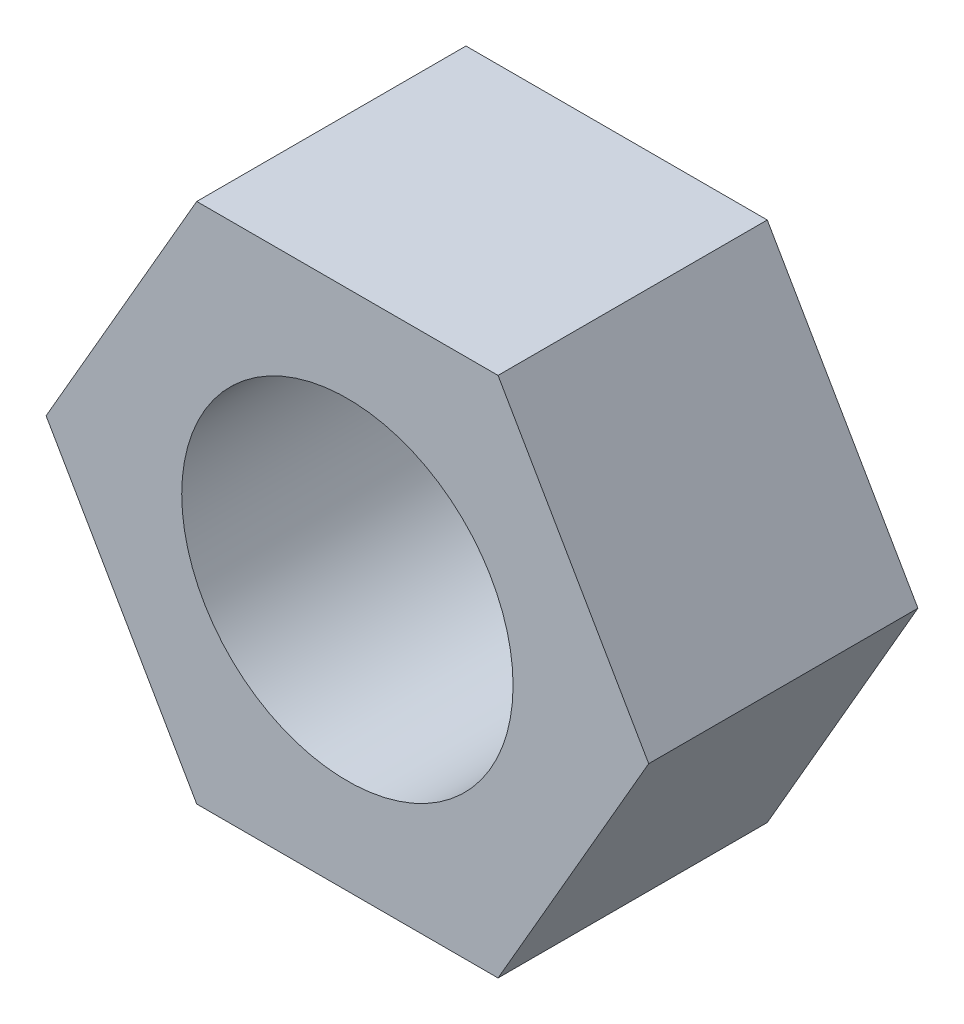
ISO-10303-21;
HEADER;
FILE_DESCRIPTION(('STEP AP214'),'2;1');
FILE_NAME('part.step','',(''),(''),'','','');
FILE_SCHEMA(('AUTOMOTIVE_DESIGN { 1 0 10303 214 1 1 1 1 }'));
ENDSEC;
DATA;
#1=APPLICATION_CONTEXT('core data for automotive mechanical design processes');
#2=APPLICATION_PROTOCOL_DEFINITION('international standard','automotive_design',2000,#1);
#3=PRODUCT_CONTEXT('',#1,'mechanical');
#4=PRODUCT('Part','Part','',(#3));
#5=PRODUCT_RELATED_PRODUCT_CATEGORY('part','',(#4));
#6=PRODUCT_DEFINITION_FORMATION('','',#4);
#7=PRODUCT_DEFINITION_CONTEXT('part definition',#1,'design');
#8=PRODUCT_DEFINITION('design','',#6,#7);
#9=PRODUCT_DEFINITION_SHAPE('','',#8);
#10=(LENGTH_UNIT() NAMED_UNIT(*) SI_UNIT(.MILLI.,.METRE.));
#11=(NAMED_UNIT(*) PLANE_ANGLE_UNIT() SI_UNIT($,.RADIAN.));
#12=(NAMED_UNIT(*) SI_UNIT($,.STERADIAN.) SOLID_ANGLE_UNIT());
#13=UNCERTAINTY_MEASURE_WITH_UNIT(LENGTH_MEASURE(1.E-05),#10,'distance_accuracy_value','');
#14=(GEOMETRIC_REPRESENTATION_CONTEXT(3) GLOBAL_UNCERTAINTY_ASSIGNED_CONTEXT((#13)) GLOBAL_UNIT_ASSIGNED_CONTEXT((#10,
#11,#12)) REPRESENTATION_CONTEXT('',''));
#15=CARTESIAN_POINT('',(0.,0.,0.));
#16=DIRECTION('',(0.,0.,1.));
#17=DIRECTION('',(1.,0.,0.));
#18=AXIS2_PLACEMENT_3D('',#15,#16,#17);
#19=CARTESIAN_POINT('',(0.,0.,6.5));
#20=DIRECTION('',(0.,0.,1.));
#21=DIRECTION('',(1.,0.,0.));
#22=AXIS2_PLACEMENT_3D('',#19,#20,#21);
#23=PLANE('',#22);
#24=DIRECTION('',(0.5,0.866025403784439,0.));
#25=VECTOR('',#24,1.);
#26=CARTESIAN_POINT('',(3.63730669589464,253.7,6.5));
#27=LINE('',#26,#25);
#28=CARTESIAN_POINT('',(3.63730669589464,253.7,6.5));
#29=VERTEX_POINT('',#28);
#30=CARTESIAN_POINT('',(7.2746133917893,260.,6.5));
#31=VERTEX_POINT('',#30);
#32=EDGE_CURVE('E128',#29,#31,#27,.T.);
#33=ORIENTED_EDGE('',*,*,#32,.T.);
#34=DIRECTION('',(-0.5,0.866025403784439,0.));
#35=VECTOR('',#34,1.);
#36=CARTESIAN_POINT('',(7.2746133917893,260.,6.5));
#37=LINE('',#36,#35);
#38=CARTESIAN_POINT('',(3.63730669589464,266.3,6.5));
#39=VERTEX_POINT('',#38);
#40=EDGE_CURVE('E86',#31,#39,#37,.T.);
#41=ORIENTED_EDGE('',*,*,#40,.T.);
#42=DIRECTION('',(-1.,0.,0.));
#43=VECTOR('',#42,1.);
#44=CARTESIAN_POINT('',(3.63730669589464,266.3,6.5));
#45=LINE('',#44,#43);
#46=CARTESIAN_POINT('',(-3.6373066958946,266.3,6.5));
#47=VERTEX_POINT('',#46);
#48=EDGE_CURVE('E99',#39,#47,#45,.T.);
#49=ORIENTED_EDGE('',*,*,#48,.T.);
#50=DIRECTION('',(-0.500000000000001,-0.866025403784438,0.));
#51=VECTOR('',#50,1.);
#52=CARTESIAN_POINT('',(-3.6373066958946,266.3,6.5));
#53=LINE('',#52,#51);
#54=CARTESIAN_POINT('',(-7.2746133917893,260.,6.5));
#55=VERTEX_POINT('',#54);
#56=EDGE_CURVE('E93',#47,#55,#53,.T.);
#57=ORIENTED_EDGE('',*,*,#56,.T.);
#58=DIRECTION('',(0.499999999999999,-0.866025403784439,0.));
#59=VECTOR('',#58,1.);
#60=CARTESIAN_POINT('',(-7.2746133917893,260.,6.5));
#61=LINE('',#60,#59);
#62=CARTESIAN_POINT('',(-3.63730669589468,253.7,6.5));
#63=VERTEX_POINT('',#62);
#64=EDGE_CURVE('E97',#55,#63,#61,.T.);
#65=ORIENTED_EDGE('',*,*,#64,.T.);
#66=DIRECTION('',(1.,0.,0.));
#67=VECTOR('',#66,1.);
#68=CARTESIAN_POINT('',(-3.63730669589468,253.7,6.5));
#69=LINE('',#68,#67);
#70=EDGE_CURVE('E49',#63,#29,#69,.T.);
#71=ORIENTED_EDGE('',*,*,#70,.T.);
#72=EDGE_LOOP('',(#33,#41,#49,#57,#65,#71));
#73=FACE_BOUND('',#72,.T.);
#74=CARTESIAN_POINT('',(0.,260.,6.5));
#75=DIRECTION('',(0.,0.,1.));
#76=DIRECTION('',(1.,0.,0.));
#77=AXIS2_PLACEMENT_3D('',#74,#75,#76);
#78=CIRCLE('',#77,4.);
#79=CARTESIAN_POINT('',(-4.,260.,6.5));
#80=VERTEX_POINT('',#79);
#81=EDGE_CURVE('E121',#80,#80,#78,.T.);
#82=ORIENTED_EDGE('',*,*,#81,.F.);
#83=EDGE_LOOP('',(#82));
#84=FACE_BOUND('',#83,.T.);
#85=ADVANCED_FACE('F32',(#73,#84),#23,.T.);
#86=CARTESIAN_POINT('',(0.,0.,0.));
#87=DIRECTION('',(0.,0.,1.));
#88=DIRECTION('',(1.,0.,0.));
#89=AXIS2_PLACEMENT_3D('',#86,#87,#88);
#90=PLANE('',#89);
#91=DIRECTION('',(0.5,0.866025403784439,0.));
#92=VECTOR('',#91,1.);
#93=CARTESIAN_POINT('',(3.63730669589464,253.7,0.));
#94=LINE('',#93,#92);
#95=CARTESIAN_POINT('',(3.63730669589464,253.7,0.));
#96=VERTEX_POINT('',#95);
#97=CARTESIAN_POINT('',(7.2746133917893,260.,0.));
#98=VERTEX_POINT('',#97);
#99=EDGE_CURVE('E117',#96,#98,#94,.T.);
#100=ORIENTED_EDGE('',*,*,#99,.F.);
#101=DIRECTION('',(1.,0.,0.));
#102=VECTOR('',#101,1.);
#103=CARTESIAN_POINT('',(-3.63730669589468,253.7,0.));
#104=LINE('',#103,#102);
#105=CARTESIAN_POINT('',(-3.63730669589468,253.7,0.));
#106=VERTEX_POINT('',#105);
#107=EDGE_CURVE('E78',#106,#96,#104,.T.);
#108=ORIENTED_EDGE('',*,*,#107,.F.);
#109=DIRECTION('',(0.499999999999999,-0.866025403784439,0.));
#110=VECTOR('',#109,1.);
#111=CARTESIAN_POINT('',(-7.2746133917893,260.,0.));
#112=LINE('',#111,#110);
#113=CARTESIAN_POINT('',(-7.2746133917893,260.,0.));
#114=VERTEX_POINT('',#113);
#115=EDGE_CURVE('E72',#114,#106,#112,.T.);
#116=ORIENTED_EDGE('',*,*,#115,.F.);
#117=DIRECTION('',(-0.500000000000001,-0.866025403784438,0.));
#118=VECTOR('',#117,1.);
#119=CARTESIAN_POINT('',(-3.6373066958946,266.3,0.));
#120=LINE('',#119,#118);
#121=CARTESIAN_POINT('',(-3.6373066958946,266.3,0.));
#122=VERTEX_POINT('',#121);
#123=EDGE_CURVE('E107',#122,#114,#120,.T.);
#124=ORIENTED_EDGE('',*,*,#123,.F.);
#125=DIRECTION('',(-1.,0.,0.));
#126=VECTOR('',#125,1.);
#127=CARTESIAN_POINT('',(3.63730669589464,266.3,0.));
#128=LINE('',#127,#126);
#129=CARTESIAN_POINT('',(3.63730669589464,266.3,0.));
#130=VERTEX_POINT('',#129);
#131=EDGE_CURVE('E123',#130,#122,#128,.T.);
#132=ORIENTED_EDGE('',*,*,#131,.F.);
#133=DIRECTION('',(-0.5,0.866025403784439,0.));
#134=VECTOR('',#133,1.);
#135=CARTESIAN_POINT('',(7.2746133917893,260.,0.));
#136=LINE('',#135,#134);
#137=EDGE_CURVE('E120',#98,#130,#136,.T.);
#138=ORIENTED_EDGE('',*,*,#137,.F.);
#139=EDGE_LOOP('',(#100,#108,#116,#124,#132,#138));
#140=FACE_BOUND('',#139,.T.);
#141=CARTESIAN_POINT('',(0.,260.,0.));
#142=DIRECTION('',(0.,0.,1.));
#143=DIRECTION('',(1.,0.,0.));
#144=AXIS2_PLACEMENT_3D('',#141,#142,#143);
#145=CIRCLE('',#144,4.);
#146=CARTESIAN_POINT('',(-4.,260.,0.));
#147=VERTEX_POINT('',#146);
#148=EDGE_CURVE('E221',#147,#147,#145,.T.);
#149=ORIENTED_EDGE('',*,*,#148,.T.);
#150=EDGE_LOOP('',(#149));
#151=FACE_BOUND('',#150,.T.);
#152=ADVANCED_FACE('F137',(#140,#151),#90,.F.);
#153=CARTESIAN_POINT('',(3.63730669589464,253.7,6.5));
#154=DIRECTION('',(-0.866025403784439,0.5,0.));
#155=DIRECTION('',(-0.5,-0.866025403784439,0.));
#156=AXIS2_PLACEMENT_3D('',#153,#154,#155);
#157=PLANE('',#156);
#158=ORIENTED_EDGE('',*,*,#99,.T.);
#159=DIRECTION('',(0.,0.,-1.));
#160=VECTOR('',#159,1.);
#161=CARTESIAN_POINT('',(7.2746133917893,260.,6.5));
#162=LINE('',#161,#160);
#163=EDGE_CURVE('E11',#31,#98,#162,.T.);
#164=ORIENTED_EDGE('',*,*,#163,.F.);
#165=ORIENTED_EDGE('',*,*,#32,.F.);
#166=DIRECTION('',(0.,0.,-1.));
#167=VECTOR('',#166,1.);
#168=CARTESIAN_POINT('',(3.63730669589464,253.7,6.5));
#169=LINE('',#168,#167);
#170=EDGE_CURVE('E113',#29,#96,#169,.T.);
#171=ORIENTED_EDGE('',*,*,#170,.T.);
#172=EDGE_LOOP('',(#158,#164,#165,#171));
#173=FACE_BOUND('',#172,.T.);
#174=ADVANCED_FACE('F34',(#173),#157,.F.);
#175=CARTESIAN_POINT('',(7.2746133917893,260.,6.5));
#176=DIRECTION('',(-0.866025403784439,-0.5,0.));
#177=DIRECTION('',(0.5,-0.866025403784439,0.));
#178=AXIS2_PLACEMENT_3D('',#175,#176,#177);
#179=PLANE('',#178);
#180=ORIENTED_EDGE('',*,*,#137,.T.);
#181=DIRECTION('',(0.,0.,-1.));
#182=VECTOR('',#181,1.);
#183=CARTESIAN_POINT('',(3.63730669589464,266.3,6.5));
#184=LINE('',#183,#182);
#185=EDGE_CURVE('E41',#39,#130,#184,.T.);
#186=ORIENTED_EDGE('',*,*,#185,.F.);
#187=ORIENTED_EDGE('',*,*,#40,.F.);
#188=ORIENTED_EDGE('',*,*,#163,.T.);
#189=EDGE_LOOP('',(#180,#186,#187,#188));
#190=FACE_BOUND('',#189,.T.);
#191=ADVANCED_FACE('F162',(#190),#179,.F.);
#192=CARTESIAN_POINT('',(3.63730669589464,266.3,6.5));
#193=DIRECTION('',(0.,-1.,0.));
#194=DIRECTION('',(0.,0.,-1.));
#195=AXIS2_PLACEMENT_3D('',#192,#193,#194);
#196=PLANE('',#195);
#197=ORIENTED_EDGE('',*,*,#131,.T.);
#198=DIRECTION('',(0.,0.,-1.));
#199=VECTOR('',#198,1.);
#200=CARTESIAN_POINT('',(-3.6373066958946,266.3,6.5));
#201=LINE('',#200,#199);
#202=EDGE_CURVE('E108',#47,#122,#201,.T.);
#203=ORIENTED_EDGE('',*,*,#202,.F.);
#204=ORIENTED_EDGE('',*,*,#48,.F.);
#205=ORIENTED_EDGE('',*,*,#185,.T.);
#206=EDGE_LOOP('',(#197,#203,#204,#205));
#207=FACE_BOUND('',#206,.T.);
#208=ADVANCED_FACE('F134',(#207),#196,.F.);
#209=CARTESIAN_POINT('',(-3.6373066958946,266.3,6.5));
#210=DIRECTION('',(0.866025403784438,-0.500000000000001,0.));
#211=DIRECTION('',(0.500000000000001,0.866025403784438,0.));
#212=AXIS2_PLACEMENT_3D('',#209,#210,#211);
#213=PLANE('',#212);
#214=ORIENTED_EDGE('',*,*,#123,.T.);
#215=DIRECTION('',(0.,0.,-1.));
#216=VECTOR('',#215,1.);
#217=CARTESIAN_POINT('',(-7.2746133917893,260.,6.5));
#218=LINE('',#217,#216);
#219=EDGE_CURVE('E104',#55,#114,#218,.T.);
#220=ORIENTED_EDGE('',*,*,#219,.F.);
#221=ORIENTED_EDGE('',*,*,#56,.F.);
#222=ORIENTED_EDGE('',*,*,#202,.T.);
#223=EDGE_LOOP('',(#214,#220,#221,#222));
#224=FACE_BOUND('',#223,.T.);
#225=ADVANCED_FACE('F105',(#224),#213,.F.);
#226=CARTESIAN_POINT('',(-7.2746133917893,260.,6.5));
#227=DIRECTION('',(0.866025403784439,0.499999999999999,0.));
#228=DIRECTION('',(-0.499999999999999,0.866025403784439,0.));
#229=AXIS2_PLACEMENT_3D('',#226,#227,#228);
#230=PLANE('',#229);
#231=ORIENTED_EDGE('',*,*,#115,.T.);
#232=DIRECTION('',(0.,0.,-1.));
#233=VECTOR('',#232,1.);
#234=CARTESIAN_POINT('',(-3.63730669589468,253.7,6.5));
#235=LINE('',#234,#233);
#236=EDGE_CURVE('E109',#63,#106,#235,.T.);
#237=ORIENTED_EDGE('',*,*,#236,.F.);
#238=ORIENTED_EDGE('',*,*,#64,.F.);
#239=ORIENTED_EDGE('',*,*,#219,.T.);
#240=EDGE_LOOP('',(#231,#237,#238,#239));
#241=FACE_BOUND('',#240,.T.);
#242=ADVANCED_FACE('F111',(#241),#230,.F.);
#243=CARTESIAN_POINT('',(-3.63730669589468,253.7,6.5));
#244=DIRECTION('',(0.,1.,0.));
#245=DIRECTION('',(0.,0.,1.));
#246=AXIS2_PLACEMENT_3D('',#243,#244,#245);
#247=PLANE('',#246);
#248=ORIENTED_EDGE('',*,*,#107,.T.);
#249=ORIENTED_EDGE('',*,*,#170,.F.);
#250=ORIENTED_EDGE('',*,*,#70,.F.);
#251=ORIENTED_EDGE('',*,*,#236,.T.);
#252=EDGE_LOOP('',(#248,#249,#250,#251));
#253=FACE_BOUND('',#252,.T.);
#254=ADVANCED_FACE('F142',(#253),#247,.F.);
#255=CARTESIAN_POINT('',(0.,260.,6.5));
#256=DIRECTION('',(0.,0.,-1.));
#257=DIRECTION('',(-1.,0.,0.));
#258=AXIS2_PLACEMENT_3D('',#255,#256,#257);
#259=CYLINDRICAL_SURFACE('',#258,4.);
#260=CARTESIAN_POINT('',(-4.,260.,6.5));
#261=CARTESIAN_POINT('',(-4.,260.,6.43229166666667));
#262=CARTESIAN_POINT('',(-4.,260.,6.36458333333333));
#263=CARTESIAN_POINT('',(-4.,260.,6.22916666666667));
#264=CARTESIAN_POINT('',(-4.,260.,6.16145833333333));
#265=CARTESIAN_POINT('',(-4.,260.,6.02604166666667));
#266=CARTESIAN_POINT('',(-4.,260.,5.95833333333333));
#267=CARTESIAN_POINT('',(-4.,260.,5.82291666666667));
#268=CARTESIAN_POINT('',(-4.,260.,5.75520833333333));
#269=CARTESIAN_POINT('',(-4.,260.,5.61979166666667));
#270=CARTESIAN_POINT('',(-4.,260.,5.55208333333333));
#271=CARTESIAN_POINT('',(-4.,260.,5.41666666666667));
#272=CARTESIAN_POINT('',(-4.,260.,5.34895833333333));
#273=CARTESIAN_POINT('',(-4.,260.,5.21354166666667));
#274=CARTESIAN_POINT('',(-4.,260.,5.14583333333333));
#275=CARTESIAN_POINT('',(-4.,260.,5.01041666666667));
#276=CARTESIAN_POINT('',(-4.,260.,4.94270833333333));
#277=CARTESIAN_POINT('',(-4.,260.,4.80729166666667));
#278=CARTESIAN_POINT('',(-4.,260.,4.73958333333333));
#279=CARTESIAN_POINT('',(-4.,260.,4.60416666666667));
#280=CARTESIAN_POINT('',(-4.,260.,4.53645833333333));
#281=CARTESIAN_POINT('',(-4.,260.,4.40104166666667));
#282=CARTESIAN_POINT('',(-4.,260.,4.33333333333333));
#283=CARTESIAN_POINT('',(-4.,260.,4.19791666666667));
#284=CARTESIAN_POINT('',(-4.,260.,4.13020833333333));
#285=CARTESIAN_POINT('',(-4.,260.,3.99479166666667));
#286=CARTESIAN_POINT('',(-4.,260.,3.92708333333333));
#287=CARTESIAN_POINT('',(-4.,260.,3.79166666666667));
#288=CARTESIAN_POINT('',(-4.,260.,3.72395833333333));
#289=CARTESIAN_POINT('',(-4.,260.,3.58854166666667));
#290=CARTESIAN_POINT('',(-4.,260.,3.52083333333333));
#291=CARTESIAN_POINT('',(-4.,260.,3.38541666666667));
#292=CARTESIAN_POINT('',(-4.,260.,3.31770833333333));
#293=CARTESIAN_POINT('',(-4.,260.,3.18229166666667));
#294=CARTESIAN_POINT('',(-4.,260.,3.11458333333333));
#295=CARTESIAN_POINT('',(-4.,260.,2.97916666666667));
#296=CARTESIAN_POINT('',(-4.,260.,2.91145833333333));
#297=CARTESIAN_POINT('',(-4.,260.,2.77604166666667));
#298=CARTESIAN_POINT('',(-4.,260.,2.70833333333333));
#299=CARTESIAN_POINT('',(-4.,260.,2.57291666666667));
#300=CARTESIAN_POINT('',(-4.,260.,2.50520833333333));
#301=CARTESIAN_POINT('',(-4.,260.,2.36979166666667));
#302=CARTESIAN_POINT('',(-4.,260.,2.30208333333333));
#303=CARTESIAN_POINT('',(-4.,260.,2.16666666666667));
#304=CARTESIAN_POINT('',(-4.,260.,2.09895833333333));
#305=CARTESIAN_POINT('',(-4.,260.,1.96354166666667));
#306=CARTESIAN_POINT('',(-4.,260.,1.89583333333333));
#307=CARTESIAN_POINT('',(-4.,260.,1.76041666666667));
#308=CARTESIAN_POINT('',(-4.,260.,1.69270833333333));
#309=CARTESIAN_POINT('',(-4.,260.,1.55729166666667));
#310=CARTESIAN_POINT('',(-4.,260.,1.48958333333333));
#311=CARTESIAN_POINT('',(-4.,260.,1.35416666666667));
#312=CARTESIAN_POINT('',(-4.,260.,1.28645833333333));
#313=CARTESIAN_POINT('',(-4.,260.,1.15104166666667));
#314=CARTESIAN_POINT('',(-4.,260.,1.08333333333333));
#315=CARTESIAN_POINT('',(-4.,260.,0.947916666666667));
#316=CARTESIAN_POINT('',(-4.,260.,0.880208333333333));
#317=CARTESIAN_POINT('',(-4.,260.,0.744791666666667));
#318=CARTESIAN_POINT('',(-4.,260.,0.677083333333333));
#319=CARTESIAN_POINT('',(-4.,260.,0.541666666666667));
#320=CARTESIAN_POINT('',(-4.,260.,0.473958333333333));
#321=CARTESIAN_POINT('',(-4.,260.,0.338541666666667));
#322=CARTESIAN_POINT('',(-4.,260.,0.270833333333334));
#323=CARTESIAN_POINT('',(-4.,260.,0.135416666666667));
#324=CARTESIAN_POINT('',(-4.,260.,0.0677083333333334));
#325=CARTESIAN_POINT('',(-4.,260.,0.));
#326=B_SPLINE_CURVE_WITH_KNOTS('',3,(#260,#261,#262,#263,#264,#265,#266,#267,#268,#269,#270,
#271,#272,#273,#274,#275,#276,#277,#278,#279,#280,#281,#282,#283,#284,#285,#286,#287,#288,#289,
#290,#291,#292,#293,#294,#295,#296,#297,#298,#299,#300,#301,#302,#303,#304,#305,#306,#307,#308,
#309,#310,#311,#312,#313,#314,#315,#316,#317,#318,#319,#320,#321,#322,#323,#324,#325),
.UNSPECIFIED.,.F.,.F.,(4,2,2,2,2,2,2,2,2,2,2,2,2,2,2,2,2,2,2,2,2,2,2,2,2,2,2,2,2,2,2,2,4),(0.,
0.203125,0.40625,0.609375000000001,0.812500000000001,1.015625,1.21875,1.421875,1.625,1.828125,
2.03125,2.234375,2.4375,2.640625,2.84375,3.046875,3.25,3.453125,3.65625,3.859375,4.0625,
4.265625,4.46875,4.671875,4.875,5.078125,5.28125,5.484375,5.6875,5.890625,6.09375,6.296875,6.5),.UNSPECIFIED.);
#327=EDGE_CURVE('BSEAM144',#80,#147,#326,.T.);
#328=ORIENTED_EDGE('',*,*,#81,.T.);
#329=ORIENTED_EDGE('',*,*,#148,.F.);
#330=ORIENTED_EDGE('',*,*,#327,.T.);
#331=ORIENTED_EDGE('',*,*,#327,.F.);
#332=EDGE_LOOP('',(#328,#330,#329,#331));
#333=FACE_BOUND('',#332,.T.);
#334=ADVANCED_FACE('F144',(#333),#259,.F.);
#335=CLOSED_SHELL('',(#85,#152,#174,#191,#208,#225,#242,#254,#334));
#336=MANIFOLD_SOLID_BREP('B2',#335);
#337=ADVANCED_BREP_SHAPE_REPRESENTATION('',(#18,#336),#14);
#338=SHAPE_DEFINITION_REPRESENTATION(#9,#337);
ENDSEC;
END-ISO-10303-21;
